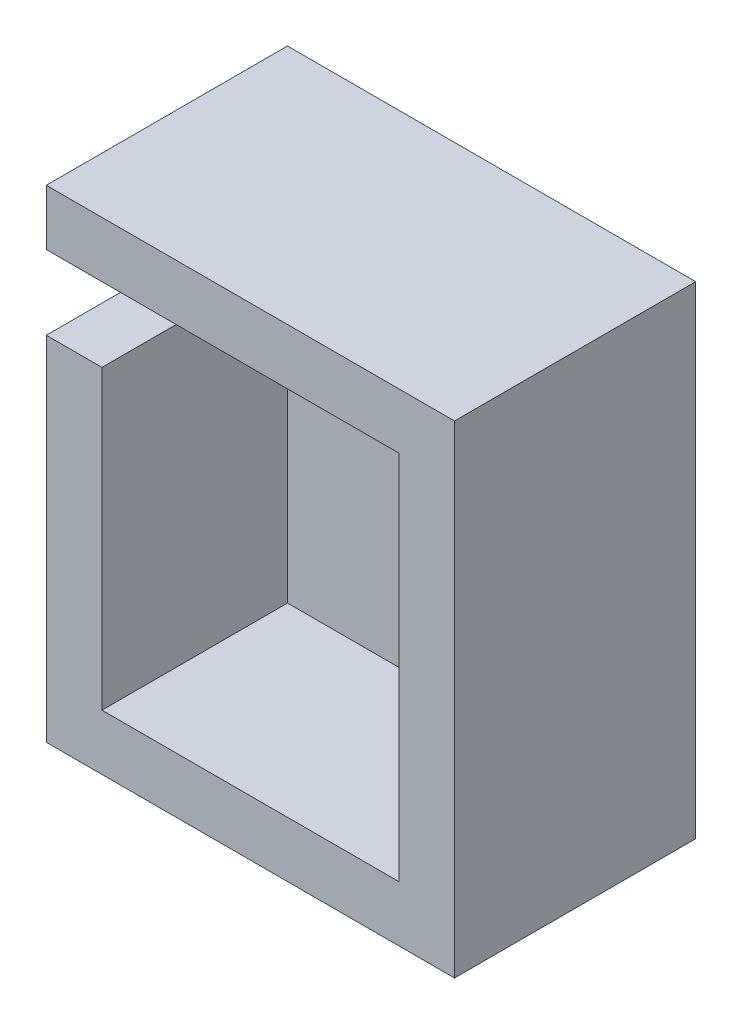
ISO-10303-21;
HEADER;
FILE_DESCRIPTION(('STEP AP214'),'2;1');
FILE_NAME('part.step','',(''),(''),'','','');
FILE_SCHEMA(('AUTOMOTIVE_DESIGN { 1 0 10303 214 1 1 1 1 }'));
ENDSEC;
DATA;
#1=APPLICATION_CONTEXT('core data for automotive mechanical design processes');
#2=APPLICATION_PROTOCOL_DEFINITION('international standard','automotive_design',2000,#1);
#3=PRODUCT_CONTEXT('',#1,'mechanical');
#4=PRODUCT('Part','Part','',(#3));
#5=PRODUCT_RELATED_PRODUCT_CATEGORY('part','',(#4));
#6=PRODUCT_DEFINITION_FORMATION('','',#4);
#7=PRODUCT_DEFINITION_CONTEXT('part definition',#1,'design');
#8=PRODUCT_DEFINITION('design','',#6,#7);
#9=PRODUCT_DEFINITION_SHAPE('','',#8);
#10=(LENGTH_UNIT() NAMED_UNIT(*) SI_UNIT(.MILLI.,.METRE.));
#11=(NAMED_UNIT(*) PLANE_ANGLE_UNIT() SI_UNIT($,.RADIAN.));
#12=(NAMED_UNIT(*) SI_UNIT($,.STERADIAN.) SOLID_ANGLE_UNIT());
#13=UNCERTAINTY_MEASURE_WITH_UNIT(LENGTH_MEASURE(1.E-05),#10,'distance_accuracy_value','');
#14=(GEOMETRIC_REPRESENTATION_CONTEXT(3) GLOBAL_UNCERTAINTY_ASSIGNED_CONTEXT((#13)) GLOBAL_UNIT_ASSIGNED_CONTEXT((#10,
#11,#12)) REPRESENTATION_CONTEXT('',''));
#15=CARTESIAN_POINT('',(0.,0.,0.));
#16=DIRECTION('',(0.,0.,1.));
#17=DIRECTION('',(1.,0.,0.));
#18=AXIS2_PLACEMENT_3D('',#15,#16,#17);
#19=CARTESIAN_POINT('',(-72.1000000000002,8.89999999999997,10.));
#20=DIRECTION('',(0.,1.,0.));
#21=DIRECTION('',(-1.,0.,0.));
#22=AXIS2_PLACEMENT_3D('',#19,#20,#21);
#23=PLANE('',#22);
#24=DIRECTION('',(1.,0.,0.));
#25=VECTOR('',#24,1.);
#26=CARTESIAN_POINT('',(-72.1000000000002,8.89999999999997,0.));
#27=LINE('',#26,#25);
#28=CARTESIAN_POINT('',(-72.1000000000002,8.89999999999997,0.));
#29=VERTEX_POINT('',#28);
#30=CARTESIAN_POINT('',(-53.1000000000002,8.89999999999997,0.));
#31=VERTEX_POINT('',#30);
#32=EDGE_CURVE('E150',#29,#31,#27,.T.);
#33=ORIENTED_EDGE('',*,*,#32,.T.);
#34=DIRECTION('',(0.,0.,-1.));
#35=VECTOR('',#34,1.);
#36=CARTESIAN_POINT('',(-53.1000000000002,8.89999999999997,10.));
#37=LINE('',#36,#35);
#38=CARTESIAN_POINT('',(-53.1000000000002,8.89999999999997,10.));
#39=VERTEX_POINT('',#38);
#40=EDGE_CURVE('E48',#39,#31,#37,.T.);
#41=ORIENTED_EDGE('',*,*,#40,.F.);
#42=DIRECTION('',(1.,0.,0.));
#43=VECTOR('',#42,1.);
#44=CARTESIAN_POINT('',(-72.1000000000002,8.89999999999997,10.));
#45=LINE('',#44,#43);
#46=CARTESIAN_POINT('',(-72.1000000000002,8.89999999999997,10.));
#47=VERTEX_POINT('',#46);
#48=EDGE_CURVE('E155',#47,#39,#45,.T.);
#49=ORIENTED_EDGE('',*,*,#48,.F.);
#50=DIRECTION('',(0.,0.,-1.));
#51=VECTOR('',#50,1.);
#52=CARTESIAN_POINT('',(-72.1000000000002,8.89999999999997,10.));
#53=LINE('',#52,#51);
#54=EDGE_CURVE('E11',#47,#29,#53,.T.);
#55=ORIENTED_EDGE('',*,*,#54,.T.);
#56=EDGE_LOOP('',(#33,#41,#49,#55));
#57=FACE_BOUND('',#56,.T.);
#58=ADVANCED_FACE('F39',(#57),#23,.F.);
#59=CARTESIAN_POINT('',(-53.1000000000002,8.89999999999997,10.));
#60=DIRECTION('',(1.,0.,0.));
#61=DIRECTION('',(0.,1.,0.));
#62=AXIS2_PLACEMENT_3D('',#59,#60,#61);
#63=PLANE('',#62);
#64=DIRECTION('',(0.,-1.,0.));
#65=VECTOR('',#64,1.);
#66=CARTESIAN_POINT('',(-53.1000000000002,8.89999999999997,0.));
#67=LINE('',#66,#65);
#68=CARTESIAN_POINT('',(-53.1000000000002,-11.1,0.));
#69=VERTEX_POINT('',#68);
#70=EDGE_CURVE('E185',#31,#69,#67,.T.);
#71=ORIENTED_EDGE('',*,*,#70,.T.);
#72=DIRECTION('',(0.,0.,-1.));
#73=VECTOR('',#72,1.);
#74=CARTESIAN_POINT('',(-53.1000000000002,-11.1,10.));
#75=LINE('',#74,#73);
#76=CARTESIAN_POINT('',(-53.1000000000002,-11.1,10.));
#77=VERTEX_POINT('',#76);
#78=EDGE_CURVE('E218',#77,#69,#75,.T.);
#79=ORIENTED_EDGE('',*,*,#78,.F.);
#80=DIRECTION('',(0.,-1.,0.));
#81=VECTOR('',#80,1.);
#82=CARTESIAN_POINT('',(-53.1000000000002,8.89999999999997,10.));
#83=LINE('',#82,#81);
#84=EDGE_CURVE('E159',#39,#77,#83,.T.);
#85=ORIENTED_EDGE('',*,*,#84,.F.);
#86=ORIENTED_EDGE('',*,*,#40,.T.);
#87=EDGE_LOOP('',(#71,#79,#85,#86));
#88=FACE_BOUND('',#87,.T.);
#89=ADVANCED_FACE('F226',(#88),#63,.F.);
#90=CARTESIAN_POINT('',(-53.1000000000002,-11.1,10.));
#91=DIRECTION('',(0.,-1.,0.));
#92=DIRECTION('',(1.,0.,0.));
#93=AXIS2_PLACEMENT_3D('',#90,#91,#92);
#94=PLANE('',#93);
#95=DIRECTION('',(-1.,0.,0.));
#96=VECTOR('',#95,1.);
#97=CARTESIAN_POINT('',(-53.1000000000002,-11.1,0.));
#98=LINE('',#97,#96);
#99=CARTESIAN_POINT('',(-69.1000000000002,-11.1,0.));
#100=VERTEX_POINT('',#99);
#101=EDGE_CURVE('E189',#69,#100,#98,.T.);
#102=ORIENTED_EDGE('',*,*,#101,.T.);
#103=DIRECTION('',(0.,0.,-1.));
#104=VECTOR('',#103,1.);
#105=CARTESIAN_POINT('',(-69.1000000000002,-11.1,10.));
#106=LINE('',#105,#104);
#107=CARTESIAN_POINT('',(-69.1000000000002,-11.1,10.));
#108=VERTEX_POINT('',#107);
#109=EDGE_CURVE('E214',#108,#100,#106,.T.);
#110=ORIENTED_EDGE('',*,*,#109,.F.);
#111=DIRECTION('',(-1.,0.,0.));
#112=VECTOR('',#111,1.);
#113=CARTESIAN_POINT('',(-53.1000000000002,-11.1,10.));
#114=LINE('',#113,#112);
#115=EDGE_CURVE('E162',#77,#108,#114,.T.);
#116=ORIENTED_EDGE('',*,*,#115,.F.);
#117=ORIENTED_EDGE('',*,*,#78,.T.);
#118=EDGE_LOOP('',(#102,#110,#116,#117));
#119=FACE_BOUND('',#118,.T.);
#120=ADVANCED_FACE('F248',(#119),#94,.F.);
#121=CARTESIAN_POINT('',(-69.1000000000002,-11.1,10.));
#122=DIRECTION('',(-1.,0.,0.));
#123=DIRECTION('',(0.,0.,1.));
#124=AXIS2_PLACEMENT_3D('',#121,#122,#123);
#125=PLANE('',#124);
#126=DIRECTION('',(0.,1.,0.));
#127=VECTOR('',#126,1.);
#128=CARTESIAN_POINT('',(-69.1000000000002,-11.1,0.));
#129=LINE('',#128,#127);
#130=CARTESIAN_POINT('',(-69.1000000000002,4.89999999999996,0.));
#131=VERTEX_POINT('',#130);
#132=EDGE_CURVE('E193',#100,#131,#129,.T.);
#133=ORIENTED_EDGE('',*,*,#132,.T.);
#134=DIRECTION('',(0.,0.,-1.));
#135=VECTOR('',#134,1.);
#136=CARTESIAN_POINT('',(-69.1000000000002,4.89999999999996,10.));
#137=LINE('',#136,#135);
#138=CARTESIAN_POINT('',(-69.1000000000002,4.89999999999996,10.));
#139=VERTEX_POINT('',#138);
#140=EDGE_CURVE('E210',#139,#131,#137,.T.);
#141=ORIENTED_EDGE('',*,*,#140,.F.);
#142=DIRECTION('',(0.,1.,0.));
#143=VECTOR('',#142,1.);
#144=CARTESIAN_POINT('',(-69.1000000000002,-11.1,10.));
#145=LINE('',#144,#143);
#146=EDGE_CURVE('E165',#108,#139,#145,.T.);
#147=ORIENTED_EDGE('',*,*,#146,.F.);
#148=ORIENTED_EDGE('',*,*,#109,.T.);
#149=EDGE_LOOP('',(#133,#141,#147,#148));
#150=FACE_BOUND('',#149,.T.);
#151=ADVANCED_FACE('F243',(#150),#125,.F.);
#152=CARTESIAN_POINT('',(-69.1000000000002,4.89999999999996,10.));
#153=DIRECTION('',(0.,-1.,0.));
#154=DIRECTION('',(0.,0.,-1.));
#155=AXIS2_PLACEMENT_3D('',#152,#153,#154);
#156=PLANE('',#155);
#157=DIRECTION('',(-1.,0.,0.));
#158=VECTOR('',#157,1.);
#159=CARTESIAN_POINT('',(-69.1000000000002,4.89999999999996,0.));
#160=LINE('',#159,#158);
#161=CARTESIAN_POINT('',(-72.1000000000002,4.89999999999996,0.));
#162=VERTEX_POINT('',#161);
#163=EDGE_CURVE('E156',#131,#162,#160,.T.);
#164=ORIENTED_EDGE('',*,*,#163,.T.);
#165=DIRECTION('',(0.,0.,-1.));
#166=VECTOR('',#165,1.);
#167=CARTESIAN_POINT('',(-72.1000000000002,4.89999999999996,10.));
#168=LINE('',#167,#166);
#169=CARTESIAN_POINT('',(-72.1000000000002,4.89999999999996,10.));
#170=VERTEX_POINT('',#169);
#171=EDGE_CURVE('E206',#170,#162,#168,.T.);
#172=ORIENTED_EDGE('',*,*,#171,.F.);
#173=DIRECTION('',(-1.,0.,0.));
#174=VECTOR('',#173,1.);
#175=CARTESIAN_POINT('',(-69.1000000000002,4.89999999999996,10.));
#176=LINE('',#175,#174);
#177=EDGE_CURVE('E168',#139,#170,#176,.T.);
#178=ORIENTED_EDGE('',*,*,#177,.F.);
#179=ORIENTED_EDGE('',*,*,#140,.T.);
#180=EDGE_LOOP('',(#164,#172,#178,#179));
#181=FACE_BOUND('',#180,.T.);
#182=ADVANCED_FACE('F240',(#181),#156,.F.);
#183=CARTESIAN_POINT('',(-72.1000000000002,4.89999999999996,10.));
#184=DIRECTION('',(1.,0.,0.));
#185=DIRECTION('',(0.,0.,-1.));
#186=AXIS2_PLACEMENT_3D('',#183,#184,#185);
#187=PLANE('',#186);
#188=ORIENTED_EDGE('',*,*,#171,.T.);
#189=DIRECTION('',(0.,1.,0.));
#190=VECTOR('',#189,1.);
#191=CARTESIAN_POINT('',(-72.1000000000002,11.9,0.));
#192=LINE('',#191,#190);
#193=EDGE_CURVE('E141',#162,#29,#192,.T.);
#194=ORIENTED_EDGE('',*,*,#193,.T.);
#195=ORIENTED_EDGE('',*,*,#54,.F.);
#196=DIRECTION('',(0.,-1.,0.));
#197=VECTOR('',#196,1.);
#198=CARTESIAN_POINT('',(-72.1000000000002,11.9,10.));
#199=LINE('',#198,#197);
#200=CARTESIAN_POINT('',(-72.1000000000002,11.9,10.));
#201=VERTEX_POINT('',#200);
#202=EDGE_CURVE('E152',#201,#47,#199,.T.);
#203=ORIENTED_EDGE('',*,*,#202,.F.);
#204=DIRECTION('',(0.,0.,-1.));
#205=VECTOR('',#204,1.);
#206=CARTESIAN_POINT('',(-72.1000000000002,11.9,10.));
#207=LINE('',#206,#205);
#208=CARTESIAN_POINT('',(-72.1000000000002,11.9,-3.));
#209=VERTEX_POINT('',#208);
#210=EDGE_CURVE('E181',#201,#209,#207,.T.);
#211=ORIENTED_EDGE('',*,*,#210,.T.);
#212=DIRECTION('',(0.,1.,0.));
#213=VECTOR('',#212,1.);
#214=CARTESIAN_POINT('',(-72.1000000000002,11.9,-3.));
#215=LINE('',#214,#213);
#216=CARTESIAN_POINT('',(-72.1000000000002,-14.1,-3.));
#217=VERTEX_POINT('',#216);
#218=EDGE_CURVE('E134',#217,#209,#215,.T.);
#219=ORIENTED_EDGE('',*,*,#218,.F.);
#220=DIRECTION('',(0.,0.,-1.));
#221=VECTOR('',#220,1.);
#222=CARTESIAN_POINT('',(-72.1000000000002,-14.1,10.));
#223=LINE('',#222,#221);
#224=CARTESIAN_POINT('',(-72.1000000000002,-14.1,10.));
#225=VERTEX_POINT('',#224);
#226=EDGE_CURVE('E123',#225,#217,#223,.T.);
#227=ORIENTED_EDGE('',*,*,#226,.F.);
#228=DIRECTION('',(0.,-1.,0.));
#229=VECTOR('',#228,1.);
#230=CARTESIAN_POINT('',(-72.1000000000002,4.89999999999996,10.));
#231=LINE('',#230,#229);
#232=EDGE_CURVE('E171',#170,#225,#231,.T.);
#233=ORIENTED_EDGE('',*,*,#232,.F.);
#234=EDGE_LOOP('',(#188,#194,#195,#203,#211,#219,#227,#233));
#235=FACE_BOUND('',#234,.T.);
#236=ADVANCED_FACE('F234',(#235),#187,.F.);
#237=CARTESIAN_POINT('',(-72.1000000000002,-14.1,10.));
#238=DIRECTION('',(0.,1.,0.));
#239=DIRECTION('',(0.,0.,1.));
#240=AXIS2_PLACEMENT_3D('',#237,#238,#239);
#241=PLANE('',#240);
#242=ORIENTED_EDGE('',*,*,#226,.T.);
#243=DIRECTION('',(-1.,0.,0.));
#244=VECTOR('',#243,1.);
#245=CARTESIAN_POINT('',(-72.1000000000002,-14.1,-3.));
#246=LINE('',#245,#244);
#247=CARTESIAN_POINT('',(-50.1000000000002,-14.1,-3.));
#248=VERTEX_POINT('',#247);
#249=EDGE_CURVE('E127',#248,#217,#246,.T.);
#250=ORIENTED_EDGE('',*,*,#249,.F.);
#251=DIRECTION('',(0.,0.,-1.));
#252=VECTOR('',#251,1.);
#253=CARTESIAN_POINT('',(-50.1000000000002,-14.1,10.));
#254=LINE('',#253,#252);
#255=CARTESIAN_POINT('',(-50.1000000000002,-14.1,10.));
#256=VERTEX_POINT('',#255);
#257=EDGE_CURVE('E113',#256,#248,#254,.T.);
#258=ORIENTED_EDGE('',*,*,#257,.F.);
#259=DIRECTION('',(1.,0.,0.));
#260=VECTOR('',#259,1.);
#261=CARTESIAN_POINT('',(-72.1000000000002,-14.1,10.));
#262=LINE('',#261,#260);
#263=EDGE_CURVE('E174',#225,#256,#262,.T.);
#264=ORIENTED_EDGE('',*,*,#263,.F.);
#265=EDGE_LOOP('',(#242,#250,#258,#264));
#266=FACE_BOUND('',#265,.T.);
#267=ADVANCED_FACE('F128',(#266),#241,.F.);
#268=CARTESIAN_POINT('',(-50.1000000000002,-14.1,10.));
#269=DIRECTION('',(-1.,0.,0.));
#270=DIRECTION('',(0.,0.,1.));
#271=AXIS2_PLACEMENT_3D('',#268,#269,#270);
#272=PLANE('',#271);
#273=ORIENTED_EDGE('',*,*,#257,.T.);
#274=DIRECTION('',(0.,-1.,0.));
#275=VECTOR('',#274,1.);
#276=CARTESIAN_POINT('',(-50.1000000000002,-14.1,-3.));
#277=LINE('',#276,#275);
#278=CARTESIAN_POINT('',(-50.1000000000002,11.9,-3.));
#279=VERTEX_POINT('',#278);
#280=EDGE_CURVE('E118',#279,#248,#277,.T.);
#281=ORIENTED_EDGE('',*,*,#280,.F.);
#282=DIRECTION('',(0.,0.,-1.));
#283=VECTOR('',#282,1.);
#284=CARTESIAN_POINT('',(-50.1000000000002,11.9,10.));
#285=LINE('',#284,#283);
#286=CARTESIAN_POINT('',(-50.1000000000002,11.9,10.));
#287=VERTEX_POINT('',#286);
#288=EDGE_CURVE('E124',#287,#279,#285,.T.);
#289=ORIENTED_EDGE('',*,*,#288,.F.);
#290=DIRECTION('',(0.,1.,0.));
#291=VECTOR('',#290,1.);
#292=CARTESIAN_POINT('',(-50.1000000000002,-14.1,10.));
#293=LINE('',#292,#291);
#294=EDGE_CURVE('E119',#256,#287,#293,.T.);
#295=ORIENTED_EDGE('',*,*,#294,.F.);
#296=EDGE_LOOP('',(#273,#281,#289,#295));
#297=FACE_BOUND('',#296,.T.);
#298=ADVANCED_FACE('F115',(#297),#272,.F.);
#299=CARTESIAN_POINT('',(-50.1000000000002,11.9,10.));
#300=DIRECTION('',(0.,-1.,0.));
#301=DIRECTION('',(1.,0.,0.));
#302=AXIS2_PLACEMENT_3D('',#299,#300,#301);
#303=PLANE('',#302);
#304=ORIENTED_EDGE('',*,*,#288,.T.);
#305=DIRECTION('',(1.,0.,0.));
#306=VECTOR('',#305,1.);
#307=CARTESIAN_POINT('',(-50.1000000000002,11.9,-3.));
#308=LINE('',#307,#306);
#309=EDGE_CURVE('E139',#209,#279,#308,.T.);
#310=ORIENTED_EDGE('',*,*,#309,.F.);
#311=ORIENTED_EDGE('',*,*,#210,.F.);
#312=DIRECTION('',(-1.,0.,0.));
#313=VECTOR('',#312,1.);
#314=CARTESIAN_POINT('',(-50.1000000000002,11.9,10.));
#315=LINE('',#314,#313);
#316=EDGE_CURVE('E55',#287,#201,#315,.T.);
#317=ORIENTED_EDGE('',*,*,#316,.F.);
#318=EDGE_LOOP('',(#304,#310,#311,#317));
#319=FACE_BOUND('',#318,.T.);
#320=ADVANCED_FACE('F251',(#319),#303,.F.);
#321=CARTESIAN_POINT('',(0.,0.,10.));
#322=DIRECTION('',(0.,0.,1.));
#323=DIRECTION('',(1.,0.,0.));
#324=AXIS2_PLACEMENT_3D('',#321,#322,#323);
#325=PLANE('',#324);
#326=ORIENTED_EDGE('',*,*,#202,.T.);
#327=ORIENTED_EDGE('',*,*,#48,.T.);
#328=ORIENTED_EDGE('',*,*,#84,.T.);
#329=ORIENTED_EDGE('',*,*,#115,.T.);
#330=ORIENTED_EDGE('',*,*,#146,.T.);
#331=ORIENTED_EDGE('',*,*,#177,.T.);
#332=ORIENTED_EDGE('',*,*,#232,.T.);
#333=ORIENTED_EDGE('',*,*,#263,.T.);
#334=ORIENTED_EDGE('',*,*,#294,.T.);
#335=ORIENTED_EDGE('',*,*,#316,.T.);
#336=EDGE_LOOP('',(#326,#327,#328,#329,#330,#331,#332,#333,#334,#335));
#337=FACE_BOUND('',#336,.T.);
#338=ADVANCED_FACE('F249',(#337),#325,.T.);
#339=CARTESIAN_POINT('',(0.,0.,0.));
#340=DIRECTION('',(0.,0.,1.));
#341=DIRECTION('',(1.,0.,0.));
#342=AXIS2_PLACEMENT_3D('',#339,#340,#341);
#343=PLANE('',#342);
#344=ORIENTED_EDGE('',*,*,#163,.F.);
#345=ORIENTED_EDGE('',*,*,#132,.F.);
#346=ORIENTED_EDGE('',*,*,#101,.F.);
#347=ORIENTED_EDGE('',*,*,#70,.F.);
#348=ORIENTED_EDGE('',*,*,#32,.F.);
#349=ORIENTED_EDGE('',*,*,#193,.F.);
#350=EDGE_LOOP('',(#344,#345,#346,#347,#348,#349));
#351=FACE_BOUND('',#350,.T.);
#352=ADVANCED_FACE('F232',(#351),#343,.T.);
#353=CARTESIAN_POINT('',(0.,0.,-3.));
#354=DIRECTION('',(0.,0.,1.));
#355=DIRECTION('',(1.,0.,0.));
#356=AXIS2_PLACEMENT_3D('',#353,#354,#355);
#357=PLANE('',#356);
#358=ORIENTED_EDGE('',*,*,#280,.T.);
#359=ORIENTED_EDGE('',*,*,#249,.T.);
#360=ORIENTED_EDGE('',*,*,#218,.T.);
#361=ORIENTED_EDGE('',*,*,#309,.T.);
#362=EDGE_LOOP('',(#358,#359,#360,#361));
#363=FACE_BOUND('',#362,.T.);
#364=ADVANCED_FACE('F137',(#363),#357,.F.);
#365=CLOSED_SHELL('',(#58,#89,#120,#151,#182,#236,#267,#298,#320,#338,#352,#364));
#366=MANIFOLD_SOLID_BREP('B2',#365);
#367=ADVANCED_BREP_SHAPE_REPRESENTATION('',(#18,#366),#14);
#368=SHAPE_DEFINITION_REPRESENTATION(#9,#367);
ENDSEC;
END-ISO-10303-21;
